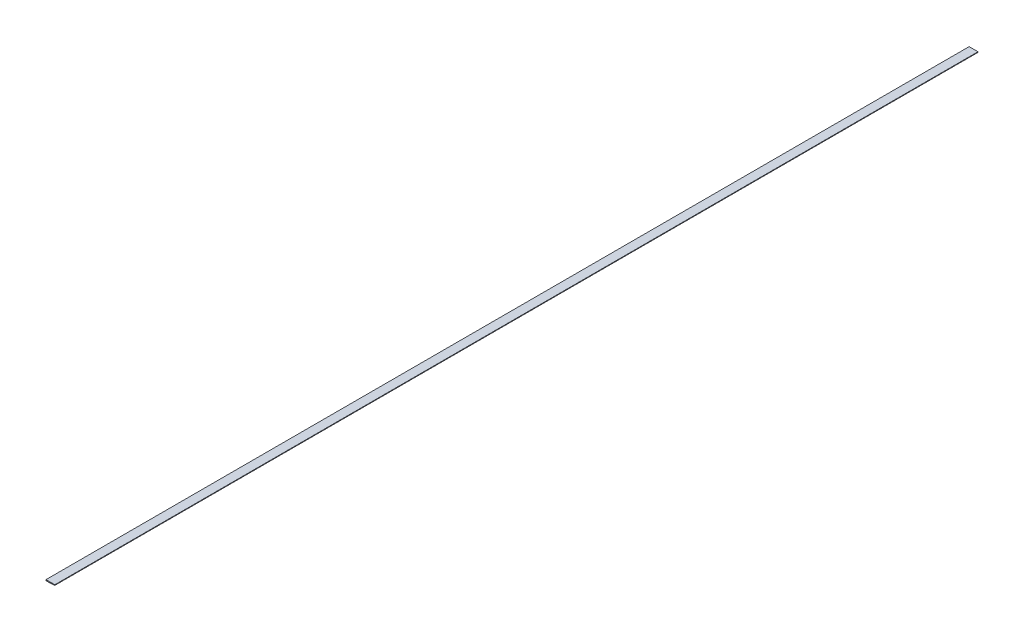
ISO-10303-21;
HEADER;
FILE_DESCRIPTION(('STEP AP214'),'2;1');
FILE_NAME('part.step','',(''),(''),'','','');
FILE_SCHEMA(('AUTOMOTIVE_DESIGN { 1 0 10303 214 1 1 1 1 }'));
ENDSEC;
DATA;
#1=APPLICATION_CONTEXT('core data for automotive mechanical design processes');
#2=APPLICATION_PROTOCOL_DEFINITION('international standard','automotive_design',2000,#1);
#3=PRODUCT_CONTEXT('',#1,'mechanical');
#4=PRODUCT('Part','Part','',(#3));
#5=PRODUCT_RELATED_PRODUCT_CATEGORY('part','',(#4));
#6=PRODUCT_DEFINITION_FORMATION('','',#4);
#7=PRODUCT_DEFINITION_CONTEXT('part definition',#1,'design');
#8=PRODUCT_DEFINITION('design','',#6,#7);
#9=PRODUCT_DEFINITION_SHAPE('','',#8);
#10=(LENGTH_UNIT() NAMED_UNIT(*) SI_UNIT(.MILLI.,.METRE.));
#11=(NAMED_UNIT(*) PLANE_ANGLE_UNIT() SI_UNIT($,.RADIAN.));
#12=(NAMED_UNIT(*) SI_UNIT($,.STERADIAN.) SOLID_ANGLE_UNIT());
#13=UNCERTAINTY_MEASURE_WITH_UNIT(LENGTH_MEASURE(1.E-05),#10,'distance_accuracy_value','');
#14=(GEOMETRIC_REPRESENTATION_CONTEXT(3) GLOBAL_UNCERTAINTY_ASSIGNED_CONTEXT((#13)) GLOBAL_UNIT_ASSIGNED_CONTEXT((#10,
#11,#12)) REPRESENTATION_CONTEXT('',''));
#15=CARTESIAN_POINT('',(0.,0.,0.));
#16=DIRECTION('',(0.,0.,1.));
#17=DIRECTION('',(1.,0.,0.));
#18=AXIS2_PLACEMENT_3D('',#15,#16,#17);
#19=CARTESIAN_POINT('',(2095.63,25.3999999999782,-5264.69513837333));
#20=DIRECTION('',(0.,-1.,0.));
#21=DIRECTION('',(1.,0.,0.));
#22=AXIS2_PLACEMENT_3D('',#19,#20,#21);
#23=PLANE('',#22);
#24=DIRECTION('',(-1.,0.,0.));
#25=VECTOR('',#24,1.);
#26=CARTESIAN_POINT('',(2095.63,25.3999999999782,-5214.39999999999));
#27=LINE('',#26,#25);
#28=CARTESIAN_POINT('',(2095.63,25.3999999999782,-5214.39999999999));
#29=VERTEX_POINT('',#28);
#30=CARTESIAN_POINT('',(2070.63,25.3999999999795,-5214.39999999999));
#31=VERTEX_POINT('',#30);
#32=EDGE_CURVE('E42',#29,#31,#27,.T.);
#33=ORIENTED_EDGE('',*,*,#32,.F.);
#34=DIRECTION('',(0.,0.,1.));
#35=VECTOR('',#34,1.);
#36=CARTESIAN_POINT('',(2095.63,25.3999999999782,-5264.69513837333));
#37=LINE('',#36,#35);
#38=CARTESIAN_POINT('',(2095.63,25.3999999999782,0.));
#39=VERTEX_POINT('',#38);
#40=EDGE_CURVE('E104',#29,#39,#37,.T.);
#41=ORIENTED_EDGE('',*,*,#40,.T.);
#42=DIRECTION('',(1.,0.,0.));
#43=VECTOR('',#42,1.);
#44=CARTESIAN_POINT('',(2095.63,25.3999999999782,0.));
#45=LINE('',#44,#43);
#46=CARTESIAN_POINT('',(2070.63,25.3999999999795,0.));
#47=VERTEX_POINT('',#46);
#48=EDGE_CURVE('E83',#47,#39,#45,.T.);
#49=ORIENTED_EDGE('',*,*,#48,.F.);
#50=DIRECTION('',(0.,0.,1.));
#51=VECTOR('',#50,1.);
#52=CARTESIAN_POINT('',(2070.63,25.3999999999795,-5264.69513837333));
#53=LINE('',#52,#51);
#54=EDGE_CURVE('E107',#31,#47,#53,.T.);
#55=ORIENTED_EDGE('',*,*,#54,.F.);
#56=EDGE_LOOP('',(#33,#41,#49,#55));
#57=FACE_BOUND('',#56,.T.);
#58=ADVANCED_FACE('F33',(#57),#23,.T.);
#59=CARTESIAN_POINT('',(2070.63,25.3999999999795,-5264.69513837333));
#60=DIRECTION('',(-1.,0.,0.));
#61=DIRECTION('',(0.,0.,1.));
#62=AXIS2_PLACEMENT_3D('',#59,#60,#61);
#63=PLANE('',#62);
#64=DIRECTION('',(0.,1.,0.));
#65=VECTOR('',#64,1.);
#66=CARTESIAN_POINT('',(2070.63,25.3999999999793,-5214.39999999999));
#67=LINE('',#66,#65);
#68=CARTESIAN_POINT('',(2070.63,30.8406749574446,-5214.39999999999));
#69=VERTEX_POINT('',#68);
#70=EDGE_CURVE('E122',#31,#69,#67,.T.);
#71=ORIENTED_EDGE('',*,*,#70,.F.);
#72=ORIENTED_EDGE('',*,*,#54,.T.);
#73=DIRECTION('',(0.,-1.,0.));
#74=VECTOR('',#73,1.);
#75=CARTESIAN_POINT('',(2070.63,25.3999999999795,0.));
#76=LINE('',#75,#74);
#77=CARTESIAN_POINT('',(2070.63,30.8406749574446,0.));
#78=VERTEX_POINT('',#77);
#79=EDGE_CURVE('E101',#78,#47,#76,.T.);
#80=ORIENTED_EDGE('',*,*,#79,.F.);
#81=DIRECTION('',(0.,0.,1.));
#82=VECTOR('',#81,1.);
#83=CARTESIAN_POINT('',(2070.63,30.8406749574446,-5264.69513837333));
#84=LINE('',#83,#82);
#85=EDGE_CURVE('E109',#69,#78,#84,.T.);
#86=ORIENTED_EDGE('',*,*,#85,.F.);
#87=EDGE_LOOP('',(#71,#72,#80,#86));
#88=FACE_BOUND('',#87,.T.);
#89=ADVANCED_FACE('F117',(#88),#63,.T.);
#90=CARTESIAN_POINT('',(2120.63,30.8406749574446,-5264.69513837333));
#91=DIRECTION('',(0.,1.,0.));
#92=DIRECTION('',(-1.,0.,0.));
#93=AXIS2_PLACEMENT_3D('',#90,#91,#92);
#94=PLANE('',#93);
#95=DIRECTION('',(1.,0.,0.));
#96=VECTOR('',#95,1.);
#97=CARTESIAN_POINT('',(2120.63,30.8406749574446,-5214.39999999999));
#98=LINE('',#97,#96);
#99=CARTESIAN_POINT('',(2120.63,30.8406749574446,-5214.39999999999));
#100=VERTEX_POINT('',#99);
#101=EDGE_CURVE('E49',#69,#100,#98,.T.);
#102=ORIENTED_EDGE('',*,*,#101,.F.);
#103=ORIENTED_EDGE('',*,*,#85,.T.);
#104=DIRECTION('',(-1.,0.,0.));
#105=VECTOR('',#104,1.);
#106=CARTESIAN_POINT('',(2120.63,30.8406749574446,0.));
#107=LINE('',#106,#105);
#108=CARTESIAN_POINT('',(2120.63,30.8406749574446,0.));
#109=VERTEX_POINT('',#108);
#110=EDGE_CURVE('E91',#109,#78,#107,.T.);
#111=ORIENTED_EDGE('',*,*,#110,.F.);
#112=DIRECTION('',(0.,0.,1.));
#113=VECTOR('',#112,1.);
#114=CARTESIAN_POINT('',(2120.63,30.8406749574446,-5264.69513837333));
#115=LINE('',#114,#113);
#116=EDGE_CURVE('E82',#100,#109,#115,.T.);
#117=ORIENTED_EDGE('',*,*,#116,.F.);
#118=EDGE_LOOP('',(#102,#103,#111,#117));
#119=FACE_BOUND('',#118,.T.);
#120=ADVANCED_FACE('F114',(#119),#94,.T.);
#121=CARTESIAN_POINT('',(2120.63,30.8406749574446,-5264.69513837333));
#122=DIRECTION('',(1.,0.,0.));
#123=DIRECTION('',(0.,0.,-1.));
#124=AXIS2_PLACEMENT_3D('',#121,#122,#123);
#125=PLANE('',#124);
#126=DIRECTION('',(0.,-1.,0.));
#127=VECTOR('',#126,1.);
#128=CARTESIAN_POINT('',(2120.63,30.8406749574444,-5214.39999999999));
#129=LINE('',#128,#127);
#130=CARTESIAN_POINT('',(2120.63,27.5872165881263,-5214.39999999999));
#131=VERTEX_POINT('',#130);
#132=EDGE_CURVE('E106',#100,#131,#129,.T.);
#133=ORIENTED_EDGE('',*,*,#132,.F.);
#134=ORIENTED_EDGE('',*,*,#116,.T.);
#135=DIRECTION('',(0.,1.,0.));
#136=VECTOR('',#135,1.);
#137=CARTESIAN_POINT('',(2120.63,30.8406749574446,0.));
#138=LINE('',#137,#136);
#139=CARTESIAN_POINT('',(2120.63,27.5872165881263,0.));
#140=VERTEX_POINT('',#139);
#141=EDGE_CURVE('E85',#140,#109,#138,.T.);
#142=ORIENTED_EDGE('',*,*,#141,.F.);
#143=DIRECTION('',(0.,0.,1.));
#144=VECTOR('',#143,1.);
#145=CARTESIAN_POINT('',(2120.63,27.5872165881263,-5264.69513837333));
#146=LINE('',#145,#144);
#147=EDGE_CURVE('E75',#131,#140,#146,.T.);
#148=ORIENTED_EDGE('',*,*,#147,.F.);
#149=EDGE_LOOP('',(#133,#134,#142,#148));
#150=FACE_BOUND('',#149,.T.);
#151=ADVANCED_FACE('F86',(#150),#125,.T.);
#152=CARTESIAN_POINT('',(2108.24552928878,26.5037157971257,-5264.69513837333));
#153=DIRECTION('',(0.0871557427476584,-0.996194698091745,0.));
#154=DIRECTION('',(0.996194698091746,0.0871557427476584,0.));
#155=AXIS2_PLACEMENT_3D('',#152,#153,#154);
#156=PLANE('',#155);
#157=DIRECTION('',(-0.996194698091746,-0.0871557427476584,0.));
#158=VECTOR('',#157,1.);
#159=CARTESIAN_POINT('',(2108.24552928878,26.5037157971257,-5214.39999999999));
#160=LINE('',#159,#158);
#161=EDGE_CURVE('E11',#131,#29,#160,.T.);
#162=ORIENTED_EDGE('',*,*,#161,.F.);
#163=ORIENTED_EDGE('',*,*,#147,.T.);
#164=DIRECTION('',(0.996194698091746,0.0871557427476584,0.));
#165=VECTOR('',#164,1.);
#166=CARTESIAN_POINT('',(2108.24552928878,26.5037157971257,0.));
#167=LINE('',#166,#165);
#168=EDGE_CURVE('E79',#39,#140,#167,.T.);
#169=ORIENTED_EDGE('',*,*,#168,.F.);
#170=ORIENTED_EDGE('',*,*,#40,.F.);
#171=EDGE_LOOP('',(#162,#163,#169,#170));
#172=FACE_BOUND('',#171,.T.);
#173=ADVANCED_FACE('F35',(#172),#156,.T.);
#174=CARTESIAN_POINT('',(0.,0.,0.));
#175=DIRECTION('',(0.,0.,-1.));
#176=DIRECTION('',(-1.,0.,0.));
#177=AXIS2_PLACEMENT_3D('',#174,#175,#176);
#178=PLANE('',#177);
#179=ORIENTED_EDGE('',*,*,#48,.T.);
#180=ORIENTED_EDGE('',*,*,#168,.T.);
#181=ORIENTED_EDGE('',*,*,#141,.T.);
#182=ORIENTED_EDGE('',*,*,#110,.T.);
#183=ORIENTED_EDGE('',*,*,#79,.T.);
#184=EDGE_LOOP('',(#179,#180,#181,#182,#183));
#185=FACE_BOUND('',#184,.T.);
#186=ADVANCED_FACE('F93',(#185),#178,.F.);
#187=CARTESIAN_POINT('',(0.,22.6313999999972,-5214.39999999999));
#188=DIRECTION('',(0.,0.,1.));
#189=DIRECTION('',(0.,1.,0.));
#190=AXIS2_PLACEMENT_3D('',#187,#188,#189);
#191=PLANE('',#190);
#192=ORIENTED_EDGE('',*,*,#32,.T.);
#193=ORIENTED_EDGE('',*,*,#70,.T.);
#194=ORIENTED_EDGE('',*,*,#101,.T.);
#195=ORIENTED_EDGE('',*,*,#132,.T.);
#196=ORIENTED_EDGE('',*,*,#161,.T.);
#197=EDGE_LOOP('',(#192,#193,#194,#195,#196));
#198=FACE_BOUND('',#197,.T.);
#199=ADVANCED_FACE('F125',(#198),#191,.F.);
#200=CLOSED_SHELL('',(#58,#89,#120,#151,#173,#186,#199));
#201=MANIFOLD_SOLID_BREP('B2',#200);
#202=ADVANCED_BREP_SHAPE_REPRESENTATION('',(#18,#201),#14);
#203=SHAPE_DEFINITION_REPRESENTATION(#9,#202);
ENDSEC;
END-ISO-10303-21;
